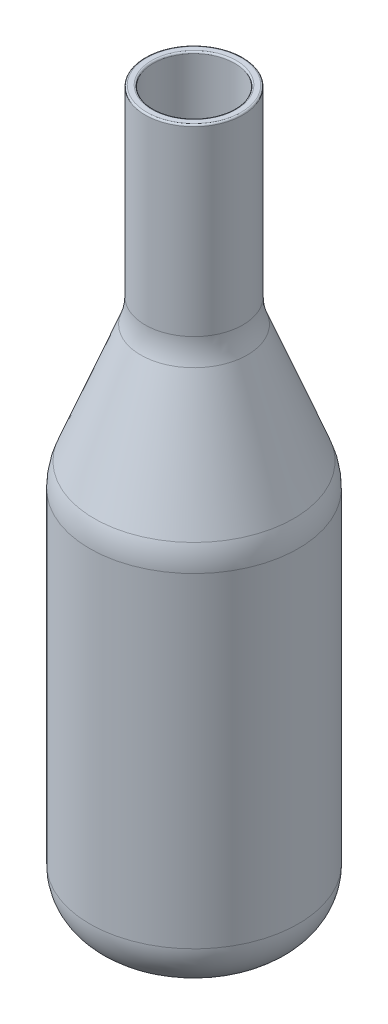
ISO-10303-21;
HEADER;
FILE_DESCRIPTION(('STEP AP214'),'2;1');
FILE_NAME('part.step','',(''),(''),'','','');
FILE_SCHEMA(('AUTOMOTIVE_DESIGN { 1 0 10303 214 1 1 1 1 }'));
ENDSEC;
DATA;
#1=APPLICATION_CONTEXT('core data for automotive mechanical design processes');
#2=APPLICATION_PROTOCOL_DEFINITION('international standard','automotive_design',2000,#1);
#3=PRODUCT_CONTEXT('',#1,'mechanical');
#4=PRODUCT('Part','Part','',(#3));
#5=PRODUCT_RELATED_PRODUCT_CATEGORY('part','',(#4));
#6=PRODUCT_DEFINITION_FORMATION('','',#4);
#7=PRODUCT_DEFINITION_CONTEXT('part definition',#1,'design');
#8=PRODUCT_DEFINITION('design','',#6,#7);
#9=PRODUCT_DEFINITION_SHAPE('','',#8);
#10=(LENGTH_UNIT() NAMED_UNIT(*) SI_UNIT(.MILLI.,.METRE.));
#11=(NAMED_UNIT(*) PLANE_ANGLE_UNIT() SI_UNIT($,.RADIAN.));
#12=(NAMED_UNIT(*) SI_UNIT($,.STERADIAN.) SOLID_ANGLE_UNIT());
#13=UNCERTAINTY_MEASURE_WITH_UNIT(LENGTH_MEASURE(1.E-05),#10,'distance_accuracy_value','');
#14=(GEOMETRIC_REPRESENTATION_CONTEXT(3) GLOBAL_UNCERTAINTY_ASSIGNED_CONTEXT((#13)) GLOBAL_UNIT_ASSIGNED_CONTEXT((#10,
#11,#12)) REPRESENTATION_CONTEXT('',''));
#15=CARTESIAN_POINT('',(0.,0.,0.));
#16=DIRECTION('',(0.,0.,1.));
#17=DIRECTION('',(1.,0.,0.));
#18=AXIS2_PLACEMENT_3D('',#15,#16,#17);
#19=CARTESIAN_POINT('',(0.,221.5,0.));
#20=DIRECTION('',(0.,-1.,0.));
#21=DIRECTION('',(0.,0.,-1.));
#22=AXIS2_PLACEMENT_3D('',#19,#20,#21);
#23=TOROIDAL_SURFACE('',#22,13.,0.5);
#24=CARTESIAN_POINT('',(0.,221.5,0.));
#25=DIRECTION('',(0.,-1.,0.));
#26=DIRECTION('',(0.,0.,-1.));
#27=AXIS2_PLACEMENT_3D('',#24,#25,#26);
#28=CIRCLE('',#27,12.5);
#29=CARTESIAN_POINT('',(0.,221.5,-12.5));
#30=VERTEX_POINT('',#29);
#31=EDGE_CURVE('E104',#30,#30,#28,.T.);
#32=ORIENTED_EDGE('',*,*,#31,.T.);
#33=EDGE_LOOP('',(#32));
#34=FACE_BOUND('',#33,.T.);
#35=CARTESIAN_POINT('',(0.,222.,0.));
#36=DIRECTION('',(0.,-1.,0.));
#37=DIRECTION('',(0.,0.,-1.));
#38=AXIS2_PLACEMENT_3D('',#35,#36,#37);
#39=CIRCLE('',#38,13.);
#40=CARTESIAN_POINT('',(0.,222.,-13.));
#41=VERTEX_POINT('',#40);
#42=EDGE_CURVE('E10',#41,#41,#39,.T.);
#43=ORIENTED_EDGE('',*,*,#42,.F.);
#44=EDGE_LOOP('',(#43));
#45=FACE_BOUND('',#44,.T.);
#46=ADVANCED_FACE('F37',(#34,#45),#23,.T.);
#47=CARTESIAN_POINT('',(0.,222.,-14.5));
#48=DIRECTION('',(0.,1.,0.));
#49=DIRECTION('',(0.,0.,1.));
#50=AXIS2_PLACEMENT_3D('',#47,#48,#49);
#51=PLANE('',#50);
#52=ORIENTED_EDGE('',*,*,#42,.T.);
#53=EDGE_LOOP('',(#52));
#54=FACE_BOUND('',#53,.T.);
#55=CARTESIAN_POINT('',(0.,222.,0.));
#56=DIRECTION('',(0.,-1.,0.));
#57=DIRECTION('',(0.,0.,-1.));
#58=AXIS2_PLACEMENT_3D('',#55,#56,#57);
#59=CIRCLE('',#58,14.5);
#60=CARTESIAN_POINT('',(0.,222.,-14.5));
#61=VERTEX_POINT('',#60);
#62=EDGE_CURVE('E44',#61,#61,#59,.T.);
#63=ORIENTED_EDGE('',*,*,#62,.F.);
#64=EDGE_LOOP('',(#63));
#65=FACE_BOUND('',#64,.T.);
#66=ADVANCED_FACE('F123',(#54,#65),#51,.T.);
#67=CARTESIAN_POINT('',(0.,221.5,0.));
#68=DIRECTION('',(0.,-1.,0.));
#69=DIRECTION('',(0.,0.,-1.));
#70=AXIS2_PLACEMENT_3D('',#67,#68,#69);
#71=TOROIDAL_SURFACE('',#70,14.5,0.500000000000001);
#72=ORIENTED_EDGE('',*,*,#62,.T.);
#73=EDGE_LOOP('',(#72));
#74=FACE_BOUND('',#73,.T.);
#75=CARTESIAN_POINT('',(0.,221.5,0.));
#76=DIRECTION('',(0.,-1.,0.));
#77=DIRECTION('',(0.,0.,-1.));
#78=AXIS2_PLACEMENT_3D('',#75,#76,#77);
#79=CIRCLE('',#78,15.);
#80=CARTESIAN_POINT('',(0.,221.5,-15.));
#81=VERTEX_POINT('',#80);
#82=EDGE_CURVE('E49',#81,#81,#79,.T.);
#83=ORIENTED_EDGE('',*,*,#82,.F.);
#84=EDGE_LOOP('',(#83));
#85=FACE_BOUND('',#84,.T.);
#86=ADVANCED_FACE('F127',(#74,#85),#71,.T.);
#87=CARTESIAN_POINT('',(0.,0.,0.));
#88=DIRECTION('',(0.,-1.,0.));
#89=DIRECTION('',(0.,0.,-1.));
#90=AXIS2_PLACEMENT_3D('',#87,#88,#89);
#91=CYLINDRICAL_SURFACE('',#90,15.);
#92=ORIENTED_EDGE('',*,*,#82,.T.);
#93=EDGE_LOOP('',(#92));
#94=FACE_BOUND('',#93,.T.);
#95=CARTESIAN_POINT('',(0.,165.708271497103,0.));
#96=DIRECTION('',(0.,-1.,0.));
#97=DIRECTION('',(0.,0.,-1.));
#98=AXIS2_PLACEMENT_3D('',#95,#96,#97);
#99=CIRCLE('',#98,15.);
#100=CARTESIAN_POINT('',(0.,165.708271497103,-15.));
#101=VERTEX_POINT('',#100);
#102=EDGE_CURVE('E54',#101,#101,#99,.T.);
#103=ORIENTED_EDGE('',*,*,#102,.F.);
#104=EDGE_LOOP('',(#103));
#105=FACE_BOUND('',#104,.T.);
#106=ADVANCED_FACE('F131',(#94,#105),#91,.T.);
#107=CARTESIAN_POINT('',(0.,165.708271497103,0.));
#108=DIRECTION('',(0.,-1.,0.));
#109=DIRECTION('',(0.,0.,-1.));
#110=AXIS2_PLACEMENT_3D('',#107,#108,#109);
#111=TOROIDAL_SURFACE('',#110,35.,20.);
#112=ORIENTED_EDGE('',*,*,#102,.T.);
#113=EDGE_LOOP('',(#112));
#114=FACE_BOUND('',#113,.T.);
#115=CARTESIAN_POINT('',(0.,158.414220463475,0.));
#116=DIRECTION('',(0.,-1.,0.));
#117=DIRECTION('',(0.,0.,-1.));
#118=AXIS2_PLACEMENT_3D('',#115,#116,#117);
#119=CIRCLE('',#118,16.3775184382204);
#120=CARTESIAN_POINT('',(0.,158.414220463475,-16.3775184382204));
#121=VERTEX_POINT('',#120);
#122=EDGE_CURVE('E60',#121,#121,#119,.T.);
#123=ORIENTED_EDGE('',*,*,#122,.F.);
#124=EDGE_LOOP('',(#123));
#125=FACE_BOUND('',#124,.T.);
#126=ADVANCED_FACE('F137',(#114,#125),#111,.F.);
#127=CARTESIAN_POINT('',(0.,122.045327252599,0.));
#128=DIRECTION('',(0.,-1.,0.));
#129=DIRECTION('',(0.,0.,-1.));
#130=AXIS2_PLACEMENT_3D('',#127,#128,#129);
#131=CONICAL_SURFACE('',#130,30.6224815617797,0.373313332296151);
#132=ORIENTED_EDGE('',*,*,#122,.T.);
#133=EDGE_LOOP('',(#132));
#134=FACE_BOUND('',#133,.T.);
#135=CARTESIAN_POINT('',(0.,122.045327252599,0.));
#136=DIRECTION('',(0.,-1.,0.));
#137=DIRECTION('',(0.,0.,-1.));
#138=AXIS2_PLACEMENT_3D('',#135,#136,#137);
#139=CIRCLE('',#138,30.6224815617797);
#140=CARTESIAN_POINT('',(0.,122.045327252599,-30.6224815617797));
#141=VERTEX_POINT('',#140);
#142=EDGE_CURVE('E64',#141,#141,#139,.T.);
#143=ORIENTED_EDGE('',*,*,#142,.F.);
#144=EDGE_LOOP('',(#143));
#145=FACE_BOUND('',#144,.T.);
#146=ADVANCED_FACE('F141',(#134,#145),#131,.T.);
#147=CARTESIAN_POINT('',(0.,114.75127621897,0.));
#148=DIRECTION('',(0.,-1.,0.));
#149=DIRECTION('',(0.,0.,-1.));
#150=AXIS2_PLACEMENT_3D('',#147,#148,#149);
#151=DEGENERATE_TOROIDAL_SURFACE('',#150,12.,20.,.T.);
#152=ORIENTED_EDGE('',*,*,#142,.T.);
#153=EDGE_LOOP('',(#152));
#154=FACE_BOUND('',#153,.T.);
#155=CARTESIAN_POINT('',(0.,114.75127621897,0.));
#156=DIRECTION('',(0.,-1.,0.));
#157=DIRECTION('',(0.,0.,-1.));
#158=AXIS2_PLACEMENT_3D('',#155,#156,#157);
#159=CIRCLE('',#158,32.);
#160=CARTESIAN_POINT('',(0.,114.75127621897,-32.));
#161=VERTEX_POINT('',#160);
#162=EDGE_CURVE('E68',#161,#161,#159,.T.);
#163=ORIENTED_EDGE('',*,*,#162,.F.);
#164=EDGE_LOOP('',(#163));
#165=FACE_BOUND('',#164,.T.);
#166=ADVANCED_FACE('F145',(#154,#165),#151,.T.);
#167=CARTESIAN_POINT('',(0.,0.,0.));
#168=DIRECTION('',(0.,-1.,0.));
#169=DIRECTION('',(0.,0.,-1.));
#170=AXIS2_PLACEMENT_3D('',#167,#168,#169);
#171=CYLINDRICAL_SURFACE('',#170,32.);
#172=ORIENTED_EDGE('',*,*,#162,.T.);
#173=EDGE_LOOP('',(#172));
#174=FACE_BOUND('',#173,.T.);
#175=CARTESIAN_POINT('',(0.,15.,0.));
#176=DIRECTION('',(0.,-1.,0.));
#177=DIRECTION('',(0.,0.,-1.));
#178=AXIS2_PLACEMENT_3D('',#175,#176,#177);
#179=CIRCLE('',#178,32.);
#180=CARTESIAN_POINT('',(0.,15.,-32.));
#181=VERTEX_POINT('',#180);
#182=EDGE_CURVE('E72',#181,#181,#179,.T.);
#183=ORIENTED_EDGE('',*,*,#182,.F.);
#184=EDGE_LOOP('',(#183));
#185=FACE_BOUND('',#184,.T.);
#186=ADVANCED_FACE('F149',(#174,#185),#171,.T.);
#187=CARTESIAN_POINT('',(0.,15.,0.));
#188=DIRECTION('',(0.,-1.,0.));
#189=DIRECTION('',(0.,0.,-1.));
#190=AXIS2_PLACEMENT_3D('',#187,#188,#189);
#191=TOROIDAL_SURFACE('',#190,17.,15.);
#192=ORIENTED_EDGE('',*,*,#182,.T.);
#193=EDGE_LOOP('',(#192));
#194=FACE_BOUND('',#193,.T.);
#195=CARTESIAN_POINT('',(0.,0.,0.));
#196=DIRECTION('',(0.,-1.,0.));
#197=DIRECTION('',(0.,0.,-1.));
#198=AXIS2_PLACEMENT_3D('',#195,#196,#197);
#199=CIRCLE('',#198,17.);
#200=CARTESIAN_POINT('',(0.,0.,-17.));
#201=VERTEX_POINT('',#200);
#202=EDGE_CURVE('E76',#201,#201,#199,.T.);
#203=ORIENTED_EDGE('',*,*,#202,.F.);
#204=EDGE_LOOP('',(#203));
#205=FACE_BOUND('',#204,.T.);
#206=ADVANCED_FACE('F153',(#194,#205),#191,.T.);
#207=CARTESIAN_POINT('',(0.,0.,0.));
#208=DIRECTION('',(0.,-1.,0.));
#209=DIRECTION('',(0.,0.,-1.));
#210=AXIS2_PLACEMENT_3D('',#207,#208,#209);
#211=PLANE('',#210);
#212=ORIENTED_EDGE('',*,*,#202,.T.);
#213=EDGE_LOOP('',(#212));
#214=FACE_BOUND('',#213,.T.);
#215=ADVANCED_FACE('F157',(#214),#211,.T.);
#216=CARTESIAN_POINT('',(0.,2.5,0.));
#217=DIRECTION('',(0.,1.,0.));
#218=DIRECTION('',(0.,0.,1.));
#219=AXIS2_PLACEMENT_3D('',#216,#217,#218);
#220=PLANE('',#219);
#221=CARTESIAN_POINT('',(0.,2.5,0.));
#222=DIRECTION('',(0.,-1.,0.));
#223=DIRECTION('',(0.,0.,-1.));
#224=AXIS2_PLACEMENT_3D('',#221,#222,#223);
#225=CIRCLE('',#224,14.4999999999999);
#226=CARTESIAN_POINT('',(0.,2.5,-14.4999999999999));
#227=VERTEX_POINT('',#226);
#228=EDGE_CURVE('E80',#227,#227,#225,.T.);
#229=ORIENTED_EDGE('',*,*,#228,.F.);
#230=EDGE_LOOP('',(#229));
#231=FACE_BOUND('',#230,.T.);
#232=ADVANCED_FACE('F161',(#231),#220,.T.);
#233=CARTESIAN_POINT('',(0.,17.5,0.));
#234=DIRECTION('',(0.,-1.,0.));
#235=DIRECTION('',(0.,0.,-1.));
#236=AXIS2_PLACEMENT_3D('',#233,#234,#235);
#237=DEGENERATE_TOROIDAL_SURFACE('',#236,14.5,15.,.T.);
#238=ORIENTED_EDGE('',*,*,#228,.T.);
#239=EDGE_LOOP('',(#238));
#240=FACE_BOUND('',#239,.T.);
#241=CARTESIAN_POINT('',(0.,17.5000000000001,0.));
#242=DIRECTION('',(0.,-1.,0.));
#243=DIRECTION('',(0.,0.,-1.));
#244=AXIS2_PLACEMENT_3D('',#241,#242,#243);
#245=CIRCLE('',#244,29.5);
#246=CARTESIAN_POINT('',(0.,17.5000000000001,-29.5));
#247=VERTEX_POINT('',#246);
#248=EDGE_CURVE('E84',#247,#247,#245,.T.);
#249=ORIENTED_EDGE('',*,*,#248,.F.);
#250=EDGE_LOOP('',(#249));
#251=FACE_BOUND('',#250,.T.);
#252=ADVANCED_FACE('F165',(#240,#251),#237,.F.);
#253=CARTESIAN_POINT('',(0.,0.,0.));
#254=DIRECTION('',(0.,-1.,0.));
#255=DIRECTION('',(0.,0.,-1.));
#256=AXIS2_PLACEMENT_3D('',#253,#254,#255);
#257=CYLINDRICAL_SURFACE('',#256,29.5);
#258=ORIENTED_EDGE('',*,*,#248,.T.);
#259=EDGE_LOOP('',(#258));
#260=FACE_BOUND('',#259,.T.);
#261=CARTESIAN_POINT('',(0.,114.279138571499,0.));
#262=DIRECTION('',(0.,-1.,0.));
#263=DIRECTION('',(0.,0.,-1.));
#264=AXIS2_PLACEMENT_3D('',#261,#262,#263);
#265=CIRCLE('',#264,29.5);
#266=CARTESIAN_POINT('',(0.,114.279138571499,-29.5));
#267=VERTEX_POINT('',#266);
#268=EDGE_CURVE('E88',#267,#267,#265,.T.);
#269=ORIENTED_EDGE('',*,*,#268,.F.);
#270=EDGE_LOOP('',(#269));
#271=FACE_BOUND('',#270,.T.);
#272=ADVANCED_FACE('F169',(#260,#271),#257,.F.);
#273=CARTESIAN_POINT('',(0.,114.279138571499,0.));
#274=DIRECTION('',(0.,-1.,0.));
#275=DIRECTION('',(0.,0.,-1.));
#276=AXIS2_PLACEMENT_3D('',#273,#274,#275);
#277=DEGENERATE_TOROIDAL_SURFACE('',#276,9.50000000000002,20.,.T.);
#278=ORIENTED_EDGE('',*,*,#268,.T.);
#279=EDGE_LOOP('',(#278));
#280=FACE_BOUND('',#279,.T.);
#281=CARTESIAN_POINT('',(0.,121.573189605128,0.));
#282=DIRECTION('',(0.,-1.,0.));
#283=DIRECTION('',(0.,0.,-1.));
#284=AXIS2_PLACEMENT_3D('',#281,#282,#283);
#285=CIRCLE('',#284,28.1224815617796);
#286=CARTESIAN_POINT('',(0.,121.573189605128,-28.1224815617796));
#287=VERTEX_POINT('',#286);
#288=EDGE_CURVE('E92',#287,#287,#285,.T.);
#289=ORIENTED_EDGE('',*,*,#288,.F.);
#290=EDGE_LOOP('',(#289));
#291=FACE_BOUND('',#290,.T.);
#292=ADVANCED_FACE('F173',(#280,#291),#277,.F.);
#293=CARTESIAN_POINT('',(0.,157.942082816004,0.));
#294=DIRECTION('',(0.,-1.,0.));
#295=DIRECTION('',(0.,0.,-1.));
#296=AXIS2_PLACEMENT_3D('',#293,#294,#295);
#297=CONICAL_SURFACE('',#296,13.8775184382204,0.373313332296152);
#298=ORIENTED_EDGE('',*,*,#288,.T.);
#299=EDGE_LOOP('',(#298));
#300=FACE_BOUND('',#299,.T.);
#301=CARTESIAN_POINT('',(0.,157.942082816004,0.));
#302=DIRECTION('',(0.,-1.,0.));
#303=DIRECTION('',(0.,0.,-1.));
#304=AXIS2_PLACEMENT_3D('',#301,#302,#303);
#305=CIRCLE('',#304,13.8775184382204);
#306=CARTESIAN_POINT('',(0.,157.942082816004,-13.8775184382204));
#307=VERTEX_POINT('',#306);
#308=EDGE_CURVE('E96',#307,#307,#305,.T.);
#309=ORIENTED_EDGE('',*,*,#308,.F.);
#310=EDGE_LOOP('',(#309));
#311=FACE_BOUND('',#310,.T.);
#312=ADVANCED_FACE('F119',(#300,#311),#297,.F.);
#313=CARTESIAN_POINT('',(0.,165.236133849632,0.));
#314=DIRECTION('',(0.,-1.,0.));
#315=DIRECTION('',(0.,0.,-1.));
#316=AXIS2_PLACEMENT_3D('',#313,#314,#315);
#317=TOROIDAL_SURFACE('',#316,32.5,20.);
#318=ORIENTED_EDGE('',*,*,#308,.T.);
#319=EDGE_LOOP('',(#318));
#320=FACE_BOUND('',#319,.T.);
#321=CARTESIAN_POINT('',(0.,165.236133849632,0.));
#322=DIRECTION('',(0.,-1.,0.));
#323=DIRECTION('',(0.,0.,-1.));
#324=AXIS2_PLACEMENT_3D('',#321,#322,#323);
#325=CIRCLE('',#324,12.5);
#326=CARTESIAN_POINT('',(0.,165.236133849632,-12.5));
#327=VERTEX_POINT('',#326);
#328=EDGE_CURVE('E100',#327,#327,#325,.T.);
#329=ORIENTED_EDGE('',*,*,#328,.F.);
#330=EDGE_LOOP('',(#329));
#331=FACE_BOUND('',#330,.T.);
#332=ADVANCED_FACE('F113',(#320,#331),#317,.T.);
#333=CARTESIAN_POINT('',(0.,0.,0.));
#334=DIRECTION('',(0.,-1.,0.));
#335=DIRECTION('',(0.,0.,-1.));
#336=AXIS2_PLACEMENT_3D('',#333,#334,#335);
#337=CYLINDRICAL_SURFACE('',#336,12.5);
#338=ORIENTED_EDGE('',*,*,#328,.T.);
#339=EDGE_LOOP('',(#338));
#340=FACE_BOUND('',#339,.T.);
#341=ORIENTED_EDGE('',*,*,#31,.F.);
#342=EDGE_LOOP('',(#341));
#343=FACE_BOUND('',#342,.T.);
#344=ADVANCED_FACE('F111',(#340,#343),#337,.F.);
#345=CLOSED_SHELL('',(#46,#66,#86,#106,#126,#146,#166,#186,#206,#215,#232,#252,#272,#292,#312,
#332,#344));
#346=MANIFOLD_SOLID_BREP('B2',#345);
#347=ADVANCED_BREP_SHAPE_REPRESENTATION('',(#18,#346),#14);
#348=SHAPE_DEFINITION_REPRESENTATION(#9,#347);
ENDSEC;
END-ISO-10303-21;
